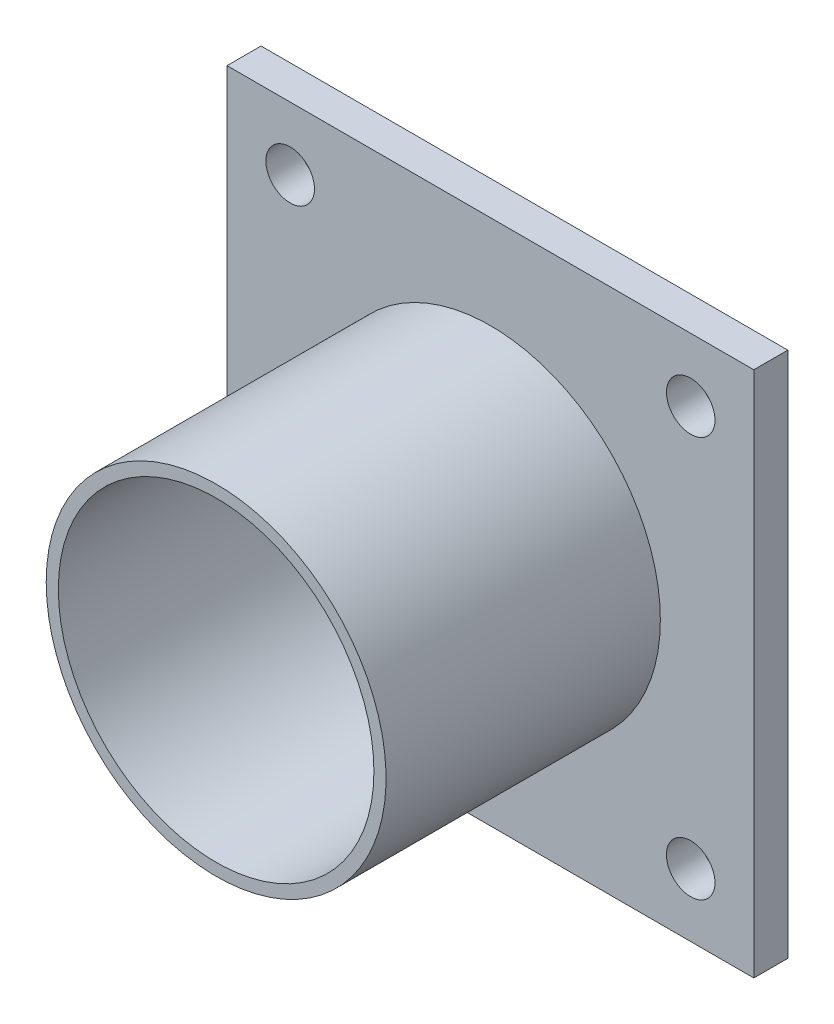
ISO-10303-21;
HEADER;
FILE_DESCRIPTION(('STEP AP214'),'2;1');
FILE_NAME('part.step','',(''),(''),'','','');
FILE_SCHEMA(('AUTOMOTIVE_DESIGN { 1 0 10303 214 1 1 1 1 }'));
ENDSEC;
DATA;
#1=APPLICATION_CONTEXT('core data for automotive mechanical design processes');
#2=APPLICATION_PROTOCOL_DEFINITION('international standard','automotive_design',2000,#1);
#3=PRODUCT_CONTEXT('',#1,'mechanical');
#4=PRODUCT('Part','Part','',(#3));
#5=PRODUCT_RELATED_PRODUCT_CATEGORY('part','',(#4));
#6=PRODUCT_DEFINITION_FORMATION('','',#4);
#7=PRODUCT_DEFINITION_CONTEXT('part definition',#1,'design');
#8=PRODUCT_DEFINITION('design','',#6,#7);
#9=PRODUCT_DEFINITION_SHAPE('','',#8);
#10=(LENGTH_UNIT() NAMED_UNIT(*) SI_UNIT(.MILLI.,.METRE.));
#11=(NAMED_UNIT(*) PLANE_ANGLE_UNIT() SI_UNIT($,.RADIAN.));
#12=(NAMED_UNIT(*) SI_UNIT($,.STERADIAN.) SOLID_ANGLE_UNIT());
#13=UNCERTAINTY_MEASURE_WITH_UNIT(LENGTH_MEASURE(1.E-05),#10,'distance_accuracy_value','');
#14=(GEOMETRIC_REPRESENTATION_CONTEXT(3) GLOBAL_UNCERTAINTY_ASSIGNED_CONTEXT((#13)) GLOBAL_UNIT_ASSIGNED_CONTEXT((#10,
#11,#12)) REPRESENTATION_CONTEXT('',''));
#15=CARTESIAN_POINT('',(0.,0.,0.));
#16=DIRECTION('',(0.,0.,1.));
#17=DIRECTION('',(1.,0.,0.));
#18=AXIS2_PLACEMENT_3D('',#15,#16,#17);
#19=CARTESIAN_POINT('',(0.,0.,1.4));
#20=DIRECTION('',(0.,0.,-1.));
#21=DIRECTION('',(-1.,0.,0.));
#22=AXIS2_PLACEMENT_3D('',#19,#20,#21);
#23=PLANE('',#22);
#24=CARTESIAN_POINT('',(19.1000000000004,2.6,1.4));
#25=DIRECTION('',(0.,0.,1.));
#26=DIRECTION('',(1.,0.,0.));
#27=AXIS2_PLACEMENT_3D('',#24,#25,#26);
#28=CIRCLE('',#27,0.999999999999998);
#29=CARTESIAN_POINT('',(20.1000000000004,2.6,1.4));
#30=VERTEX_POINT('',#29);
#31=EDGE_CURVE('E131',#30,#30,#28,.T.);
#32=ORIENTED_EDGE('',*,*,#31,.F.);
#33=EDGE_LOOP('',(#32));
#34=FACE_BOUND('',#33,.T.);
#35=CARTESIAN_POINT('',(10.85,10.85,1.4));
#36=DIRECTION('',(0.,0.,1.));
#37=DIRECTION('',(1.,0.,0.));
#38=AXIS2_PLACEMENT_3D('',#35,#36,#37);
#39=CIRCLE('',#38,7.);
#40=CARTESIAN_POINT('',(17.85,10.85,1.4));
#41=VERTEX_POINT('',#40);
#42=EDGE_CURVE('E122',#41,#41,#39,.T.);
#43=ORIENTED_EDGE('',*,*,#42,.F.);
#44=EDGE_LOOP('',(#43));
#45=FACE_BOUND('',#44,.T.);
#46=DIRECTION('',(0.,-1.,0.));
#47=VECTOR('',#46,1.);
#48=CARTESIAN_POINT('',(0.,0.,1.4));
#49=LINE('',#48,#47);
#50=CARTESIAN_POINT('',(0.,21.7,1.4));
#51=VERTEX_POINT('',#50);
#52=CARTESIAN_POINT('',(0.,0.,1.4));
#53=VERTEX_POINT('',#52);
#54=EDGE_CURVE('E92',#51,#53,#49,.T.);
#55=ORIENTED_EDGE('',*,*,#54,.T.);
#56=DIRECTION('',(1.,0.,0.));
#57=VECTOR('',#56,1.);
#58=CARTESIAN_POINT('',(0.,0.,1.4));
#59=LINE('',#58,#57);
#60=CARTESIAN_POINT('',(21.7,0.,1.4));
#61=VERTEX_POINT('',#60);
#62=EDGE_CURVE('E87',#53,#61,#59,.T.);
#63=ORIENTED_EDGE('',*,*,#62,.T.);
#64=DIRECTION('',(0.,1.,0.));
#65=VECTOR('',#64,1.);
#66=CARTESIAN_POINT('',(21.7,0.,1.4));
#67=LINE('',#66,#65);
#68=CARTESIAN_POINT('',(21.7,21.7,1.4));
#69=VERTEX_POINT('',#68);
#70=EDGE_CURVE('E90',#61,#69,#67,.T.);
#71=ORIENTED_EDGE('',*,*,#70,.T.);
#72=DIRECTION('',(-1.,0.,0.));
#73=VECTOR('',#72,1.);
#74=CARTESIAN_POINT('',(0.,21.7,1.4));
#75=LINE('',#74,#73);
#76=EDGE_CURVE('E57',#69,#51,#75,.T.);
#77=ORIENTED_EDGE('',*,*,#76,.T.);
#78=EDGE_LOOP('',(#55,#63,#71,#77));
#79=FACE_BOUND('',#78,.T.);
#80=CARTESIAN_POINT('',(2.6,19.1,1.4));
#81=DIRECTION('',(0.,0.,1.));
#82=DIRECTION('',(1.,0.,0.));
#83=AXIS2_PLACEMENT_3D('',#80,#81,#82);
#84=CIRCLE('',#83,1.);
#85=CARTESIAN_POINT('',(3.6,19.1,1.4));
#86=VERTEX_POINT('',#85);
#87=EDGE_CURVE('E107',#86,#86,#84,.T.);
#88=ORIENTED_EDGE('',*,*,#87,.F.);
#89=EDGE_LOOP('',(#88));
#90=FACE_BOUND('',#89,.T.);
#91=CARTESIAN_POINT('',(19.1,19.1,1.4));
#92=DIRECTION('',(0.,0.,1.));
#93=DIRECTION('',(1.,0.,0.));
#94=AXIS2_PLACEMENT_3D('',#91,#92,#93);
#95=CIRCLE('',#94,0.999999999999998);
#96=CARTESIAN_POINT('',(20.1,19.1,1.4));
#97=VERTEX_POINT('',#96);
#98=EDGE_CURVE('E127',#97,#97,#95,.T.);
#99=ORIENTED_EDGE('',*,*,#98,.F.);
#100=EDGE_LOOP('',(#99));
#101=FACE_BOUND('',#100,.T.);
#102=CARTESIAN_POINT('',(2.60000000000041,2.6,1.4));
#103=DIRECTION('',(0.,0.,1.));
#104=DIRECTION('',(1.,0.,0.));
#105=AXIS2_PLACEMENT_3D('',#102,#103,#104);
#106=CIRCLE('',#105,1.);
#107=CARTESIAN_POINT('',(3.60000000000041,2.6,1.4));
#108=VERTEX_POINT('',#107);
#109=EDGE_CURVE('E137',#108,#108,#106,.T.);
#110=ORIENTED_EDGE('',*,*,#109,.F.);
#111=EDGE_LOOP('',(#110));
#112=FACE_BOUND('',#111,.T.);
#113=ADVANCED_FACE('F40',(#34,#45,#79,#90,#101,#112),#23,.F.);
#114=CARTESIAN_POINT('',(0.,0.,0.));
#115=DIRECTION('',(0.,0.,-1.));
#116=DIRECTION('',(-1.,0.,0.));
#117=AXIS2_PLACEMENT_3D('',#114,#115,#116);
#118=PLANE('',#117);
#119=CARTESIAN_POINT('',(19.1000000000004,2.6,0.));
#120=DIRECTION('',(0.,0.,1.));
#121=DIRECTION('',(1.,0.,0.));
#122=AXIS2_PLACEMENT_3D('',#119,#120,#121);
#123=CIRCLE('',#122,0.999999999999998);
#124=CARTESIAN_POINT('',(20.1000000000004,2.6,0.));
#125=VERTEX_POINT('',#124);
#126=EDGE_CURVE('E134',#125,#125,#123,.T.);
#127=ORIENTED_EDGE('',*,*,#126,.T.);
#128=EDGE_LOOP('',(#127));
#129=FACE_BOUND('',#128,.T.);
#130=DIRECTION('',(0.,-1.,0.));
#131=VECTOR('',#130,1.);
#132=CARTESIAN_POINT('',(0.,0.,0.));
#133=LINE('',#132,#131);
#134=CARTESIAN_POINT('',(0.,21.7,0.));
#135=VERTEX_POINT('',#134);
#136=CARTESIAN_POINT('',(0.,0.,0.));
#137=VERTEX_POINT('',#136);
#138=EDGE_CURVE('E104',#135,#137,#133,.T.);
#139=ORIENTED_EDGE('',*,*,#138,.F.);
#140=DIRECTION('',(-1.,0.,0.));
#141=VECTOR('',#140,1.);
#142=CARTESIAN_POINT('',(0.,21.7,0.));
#143=LINE('',#142,#141);
#144=CARTESIAN_POINT('',(21.7,21.7,0.));
#145=VERTEX_POINT('',#144);
#146=EDGE_CURVE('E80',#145,#135,#143,.T.);
#147=ORIENTED_EDGE('',*,*,#146,.F.);
#148=DIRECTION('',(0.,1.,0.));
#149=VECTOR('',#148,1.);
#150=CARTESIAN_POINT('',(21.7,0.,0.));
#151=LINE('',#150,#149);
#152=CARTESIAN_POINT('',(21.7,0.,0.));
#153=VERTEX_POINT('',#152);
#154=EDGE_CURVE('E74',#153,#145,#151,.T.);
#155=ORIENTED_EDGE('',*,*,#154,.F.);
#156=DIRECTION('',(1.,0.,0.));
#157=VECTOR('',#156,1.);
#158=CARTESIAN_POINT('',(0.,0.,0.));
#159=LINE('',#158,#157);
#160=EDGE_CURVE('E96',#137,#153,#159,.T.);
#161=ORIENTED_EDGE('',*,*,#160,.F.);
#162=EDGE_LOOP('',(#139,#147,#155,#161));
#163=FACE_BOUND('',#162,.T.);
#164=CARTESIAN_POINT('',(2.6,19.1,0.));
#165=DIRECTION('',(0.,0.,1.));
#166=DIRECTION('',(1.,0.,0.));
#167=AXIS2_PLACEMENT_3D('',#164,#165,#166);
#168=CIRCLE('',#167,1.);
#169=CARTESIAN_POINT('',(3.6,19.1,0.));
#170=VERTEX_POINT('',#169);
#171=EDGE_CURVE('E119',#170,#170,#168,.T.);
#172=ORIENTED_EDGE('',*,*,#171,.T.);
#173=EDGE_LOOP('',(#172));
#174=FACE_BOUND('',#173,.T.);
#175=CARTESIAN_POINT('',(19.1,19.1,0.));
#176=DIRECTION('',(0.,0.,1.));
#177=DIRECTION('',(1.,0.,0.));
#178=AXIS2_PLACEMENT_3D('',#175,#176,#177);
#179=CIRCLE('',#178,0.999999999999998);
#180=CARTESIAN_POINT('',(20.1,19.1,0.));
#181=VERTEX_POINT('',#180);
#182=EDGE_CURVE('E128',#181,#181,#179,.T.);
#183=ORIENTED_EDGE('',*,*,#182,.T.);
#184=EDGE_LOOP('',(#183));
#185=FACE_BOUND('',#184,.T.);
#186=CARTESIAN_POINT('',(2.60000000000041,2.6,0.));
#187=DIRECTION('',(0.,0.,1.));
#188=DIRECTION('',(1.,0.,0.));
#189=AXIS2_PLACEMENT_3D('',#186,#187,#188);
#190=CIRCLE('',#189,1.);
#191=CARTESIAN_POINT('',(3.60000000000041,2.6,0.));
#192=VERTEX_POINT('',#191);
#193=EDGE_CURVE('E140',#192,#192,#190,.T.);
#194=ORIENTED_EDGE('',*,*,#193,.T.);
#195=EDGE_LOOP('',(#194));
#196=FACE_BOUND('',#195,.T.);
#197=CARTESIAN_POINT('',(10.85,10.85,0.));
#198=DIRECTION('',(0.,0.,-1.));
#199=DIRECTION('',(-1.,0.,0.));
#200=AXIS2_PLACEMENT_3D('',#197,#198,#199);
#201=CIRCLE('',#200,6.5);
#202=CARTESIAN_POINT('',(4.35,10.85,0.));
#203=VERTEX_POINT('',#202);
#204=EDGE_CURVE('E149',#203,#203,#201,.T.);
#205=ORIENTED_EDGE('',*,*,#204,.F.);
#206=EDGE_LOOP('',(#205));
#207=FACE_BOUND('',#206,.T.);
#208=ADVANCED_FACE('F115',(#129,#163,#174,#185,#196,#207),#118,.T.);
#209=CARTESIAN_POINT('',(0.,0.,1.4));
#210=DIRECTION('',(1.,0.,0.));
#211=DIRECTION('',(0.,0.,-1.));
#212=AXIS2_PLACEMENT_3D('',#209,#210,#211);
#213=PLANE('',#212);
#214=ORIENTED_EDGE('',*,*,#138,.T.);
#215=DIRECTION('',(0.,0.,-1.));
#216=VECTOR('',#215,1.);
#217=CARTESIAN_POINT('',(0.,0.,1.4));
#218=LINE('',#217,#216);
#219=EDGE_CURVE('E12',#53,#137,#218,.T.);
#220=ORIENTED_EDGE('',*,*,#219,.F.);
#221=ORIENTED_EDGE('',*,*,#54,.F.);
#222=DIRECTION('',(0.,0.,-1.));
#223=VECTOR('',#222,1.);
#224=CARTESIAN_POINT('',(0.,21.7,1.4));
#225=LINE('',#224,#223);
#226=EDGE_CURVE('E100',#51,#135,#225,.T.);
#227=ORIENTED_EDGE('',*,*,#226,.T.);
#228=EDGE_LOOP('',(#214,#220,#221,#227));
#229=FACE_BOUND('',#228,.T.);
#230=ADVANCED_FACE('F42',(#229),#213,.F.);
#231=CARTESIAN_POINT('',(0.,0.,1.4));
#232=DIRECTION('',(0.,1.,0.));
#233=DIRECTION('',(0.,0.,1.));
#234=AXIS2_PLACEMENT_3D('',#231,#232,#233);
#235=PLANE('',#234);
#236=ORIENTED_EDGE('',*,*,#160,.T.);
#237=DIRECTION('',(0.,0.,-1.));
#238=VECTOR('',#237,1.);
#239=CARTESIAN_POINT('',(21.7,0.,1.4));
#240=LINE('',#239,#238);
#241=EDGE_CURVE('E49',#61,#153,#240,.T.);
#242=ORIENTED_EDGE('',*,*,#241,.F.);
#243=ORIENTED_EDGE('',*,*,#62,.F.);
#244=ORIENTED_EDGE('',*,*,#219,.T.);
#245=EDGE_LOOP('',(#236,#242,#243,#244));
#246=FACE_BOUND('',#245,.T.);
#247=ADVANCED_FACE('F95',(#246),#235,.F.);
#248=CARTESIAN_POINT('',(21.7,0.,1.4));
#249=DIRECTION('',(-1.,0.,0.));
#250=DIRECTION('',(0.,0.,1.));
#251=AXIS2_PLACEMENT_3D('',#248,#249,#250);
#252=PLANE('',#251);
#253=ORIENTED_EDGE('',*,*,#154,.T.);
#254=DIRECTION('',(0.,0.,-1.));
#255=VECTOR('',#254,1.);
#256=CARTESIAN_POINT('',(21.7,21.7,1.4));
#257=LINE('',#256,#255);
#258=EDGE_CURVE('E97',#69,#145,#257,.T.);
#259=ORIENTED_EDGE('',*,*,#258,.F.);
#260=ORIENTED_EDGE('',*,*,#70,.F.);
#261=ORIENTED_EDGE('',*,*,#241,.T.);
#262=EDGE_LOOP('',(#253,#259,#260,#261));
#263=FACE_BOUND('',#262,.T.);
#264=ADVANCED_FACE('F98',(#263),#252,.F.);
#265=CARTESIAN_POINT('',(0.,21.7,1.4));
#266=DIRECTION('',(0.,-1.,0.));
#267=DIRECTION('',(0.,0.,-1.));
#268=AXIS2_PLACEMENT_3D('',#265,#266,#267);
#269=PLANE('',#268);
#270=ORIENTED_EDGE('',*,*,#146,.T.);
#271=ORIENTED_EDGE('',*,*,#226,.F.);
#272=ORIENTED_EDGE('',*,*,#76,.F.);
#273=ORIENTED_EDGE('',*,*,#258,.T.);
#274=EDGE_LOOP('',(#270,#271,#272,#273));
#275=FACE_BOUND('',#274,.T.);
#276=ADVANCED_FACE('F112',(#275),#269,.F.);
#277=CARTESIAN_POINT('',(2.6,19.1,1.4));
#278=DIRECTION('',(0.,0.,-1.));
#279=DIRECTION('',(-1.,0.,0.));
#280=AXIS2_PLACEMENT_3D('',#277,#278,#279);
#281=CYLINDRICAL_SURFACE('',#280,1.);
#282=ORIENTED_EDGE('',*,*,#87,.T.);
#283=EDGE_LOOP('',(#282));
#284=FACE_BOUND('',#283,.T.);
#285=ORIENTED_EDGE('',*,*,#171,.F.);
#286=EDGE_LOOP('',(#285));
#287=FACE_BOUND('',#286,.T.);
#288=ADVANCED_FACE('F177',(#284,#287),#281,.F.);
#289=CARTESIAN_POINT('',(19.1,19.1,1.4));
#290=DIRECTION('',(0.,0.,-1.));
#291=DIRECTION('',(-1.,0.,0.));
#292=AXIS2_PLACEMENT_3D('',#289,#290,#291);
#293=CYLINDRICAL_SURFACE('',#292,0.999999999999998);
#294=ORIENTED_EDGE('',*,*,#98,.T.);
#295=EDGE_LOOP('',(#294));
#296=FACE_BOUND('',#295,.T.);
#297=ORIENTED_EDGE('',*,*,#182,.F.);
#298=EDGE_LOOP('',(#297));
#299=FACE_BOUND('',#298,.T.);
#300=ADVANCED_FACE('F198',(#296,#299),#293,.F.);
#301=CARTESIAN_POINT('',(19.1000000000004,2.6,1.4));
#302=DIRECTION('',(0.,0.,-1.));
#303=DIRECTION('',(-1.,0.,0.));
#304=AXIS2_PLACEMENT_3D('',#301,#302,#303);
#305=CYLINDRICAL_SURFACE('',#304,0.999999999999998);
#306=ORIENTED_EDGE('',*,*,#31,.T.);
#307=EDGE_LOOP('',(#306));
#308=FACE_BOUND('',#307,.T.);
#309=ORIENTED_EDGE('',*,*,#126,.F.);
#310=EDGE_LOOP('',(#309));
#311=FACE_BOUND('',#310,.T.);
#312=ADVANCED_FACE('F205',(#308,#311),#305,.F.);
#313=CARTESIAN_POINT('',(2.60000000000041,2.6,1.4));
#314=DIRECTION('',(0.,0.,-1.));
#315=DIRECTION('',(-1.,0.,0.));
#316=AXIS2_PLACEMENT_3D('',#313,#314,#315);
#317=CYLINDRICAL_SURFACE('',#316,1.);
#318=ORIENTED_EDGE('',*,*,#109,.T.);
#319=EDGE_LOOP('',(#318));
#320=FACE_BOUND('',#319,.T.);
#321=ORIENTED_EDGE('',*,*,#193,.F.);
#322=EDGE_LOOP('',(#321));
#323=FACE_BOUND('',#322,.T.);
#324=ADVANCED_FACE('F213',(#320,#323),#317,.F.);
#325=CARTESIAN_POINT('',(10.85,10.85,12.7));
#326=DIRECTION('',(0.,0.,-1.));
#327=DIRECTION('',(-1.,0.,0.));
#328=AXIS2_PLACEMENT_3D('',#325,#326,#327);
#329=CYLINDRICAL_SURFACE('',#328,7.);
#330=CARTESIAN_POINT('',(10.85,10.85,12.7));
#331=DIRECTION('',(0.,0.,-1.));
#332=DIRECTION('',(-1.,0.,0.));
#333=AXIS2_PLACEMENT_3D('',#330,#331,#332);
#334=CIRCLE('',#333,7.);
#335=CARTESIAN_POINT('',(3.85,10.85,12.7));
#336=VERTEX_POINT('',#335);
#337=EDGE_CURVE('E143',#336,#336,#334,.T.);
#338=ORIENTED_EDGE('',*,*,#337,.T.);
#339=EDGE_LOOP('',(#338));
#340=FACE_BOUND('',#339,.T.);
#341=ORIENTED_EDGE('',*,*,#42,.T.);
#342=EDGE_LOOP('',(#341));
#343=FACE_BOUND('',#342,.T.);
#344=ADVANCED_FACE('F221',(#340,#343),#329,.T.);
#345=CARTESIAN_POINT('',(10.85,10.85,12.7));
#346=DIRECTION('',(0.,0.,-1.));
#347=DIRECTION('',(-1.,0.,0.));
#348=AXIS2_PLACEMENT_3D('',#345,#346,#347);
#349=PLANE('',#348);
#350=CARTESIAN_POINT('',(10.85,10.85,12.7));
#351=DIRECTION('',(0.,0.,-1.));
#352=DIRECTION('',(-1.,0.,0.));
#353=AXIS2_PLACEMENT_3D('',#350,#351,#352);
#354=CIRCLE('',#353,6.5);
#355=CARTESIAN_POINT('',(4.35,10.85,12.7));
#356=VERTEX_POINT('',#355);
#357=EDGE_CURVE('E148',#356,#356,#354,.T.);
#358=ORIENTED_EDGE('',*,*,#357,.T.);
#359=EDGE_LOOP('',(#358));
#360=FACE_BOUND('',#359,.T.);
#361=ORIENTED_EDGE('',*,*,#337,.F.);
#362=EDGE_LOOP('',(#361));
#363=FACE_BOUND('',#362,.T.);
#364=ADVANCED_FACE('F155',(#360,#363),#349,.F.);
#365=CARTESIAN_POINT('',(10.85,10.85,12.7));
#366=DIRECTION('',(0.,0.,-1.));
#367=DIRECTION('',(-1.,0.,0.));
#368=AXIS2_PLACEMENT_3D('',#365,#366,#367);
#369=CYLINDRICAL_SURFACE('',#368,6.5);
#370=ORIENTED_EDGE('',*,*,#357,.F.);
#371=EDGE_LOOP('',(#370));
#372=FACE_BOUND('',#371,.T.);
#373=ORIENTED_EDGE('',*,*,#204,.T.);
#374=EDGE_LOOP('',(#373));
#375=FACE_BOUND('',#374,.T.);
#376=ADVANCED_FACE('F158',(#372,#375),#369,.F.);
#377=CLOSED_SHELL('',(#113,#208,#230,#247,#264,#276,#288,#300,#312,#324,#344,#364,#376));
#378=MANIFOLD_SOLID_BREP('B2',#377);
#379=ADVANCED_BREP_SHAPE_REPRESENTATION('',(#18,#378),#14);
#380=SHAPE_DEFINITION_REPRESENTATION(#9,#379);
ENDSEC;
END-ISO-10303-21;
